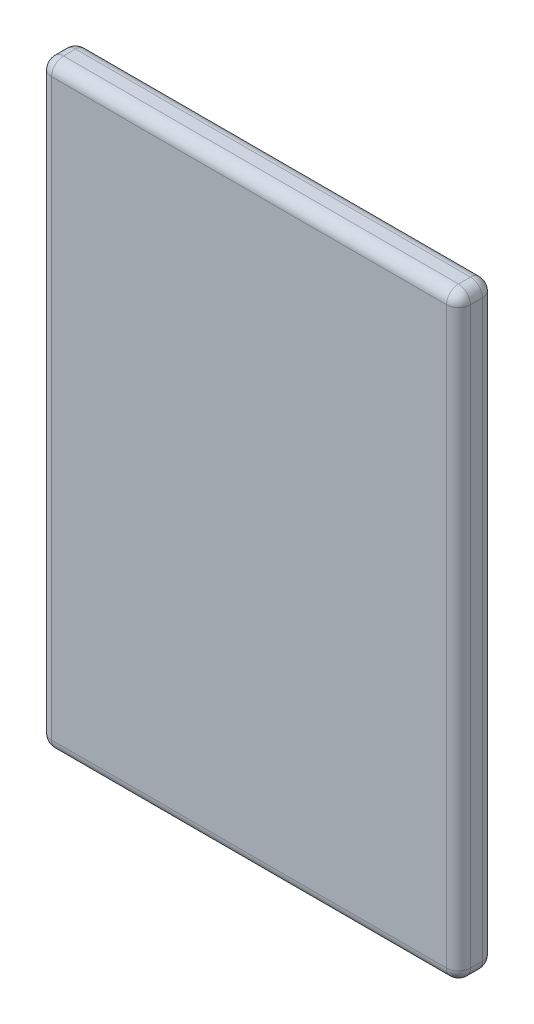
ISO-10303-21;
HEADER;
FILE_DESCRIPTION(('STEP AP214'),'2;1');
FILE_NAME('part.step','',(''),(''),'','','');
FILE_SCHEMA(('AUTOMOTIVE_DESIGN { 1 0 10303 214 1 1 1 1 }'));
ENDSEC;
DATA;
#1=APPLICATION_CONTEXT('core data for automotive mechanical design processes');
#2=APPLICATION_PROTOCOL_DEFINITION('international standard','automotive_design',2000,#1);
#3=PRODUCT_CONTEXT('',#1,'mechanical');
#4=PRODUCT('Part','Part','',(#3));
#5=PRODUCT_RELATED_PRODUCT_CATEGORY('part','',(#4));
#6=PRODUCT_DEFINITION_FORMATION('','',#4);
#7=PRODUCT_DEFINITION_CONTEXT('part definition',#1,'design');
#8=PRODUCT_DEFINITION('design','',#6,#7);
#9=PRODUCT_DEFINITION_SHAPE('','',#8);
#10=(LENGTH_UNIT() NAMED_UNIT(*) SI_UNIT(.MILLI.,.METRE.));
#11=(NAMED_UNIT(*) PLANE_ANGLE_UNIT() SI_UNIT($,.RADIAN.));
#12=(NAMED_UNIT(*) SI_UNIT($,.STERADIAN.) SOLID_ANGLE_UNIT());
#13=UNCERTAINTY_MEASURE_WITH_UNIT(LENGTH_MEASURE(1.E-05),#10,'distance_accuracy_value','');
#14=(GEOMETRIC_REPRESENTATION_CONTEXT(3) GLOBAL_UNCERTAINTY_ASSIGNED_CONTEXT((#13)) GLOBAL_UNIT_ASSIGNED_CONTEXT((#10,
#11,#12)) REPRESENTATION_CONTEXT('',''));
#15=CARTESIAN_POINT('',(0.,0.,0.));
#16=DIRECTION('',(0.,0.,1.));
#17=DIRECTION('',(1.,0.,0.));
#18=AXIS2_PLACEMENT_3D('',#15,#16,#17);
#19=CARTESIAN_POINT('',(0.,0.,6.));
#20=DIRECTION('',(1.,0.,0.));
#21=DIRECTION('',(0.,0.,-1.));
#22=AXIS2_PLACEMENT_3D('',#19,#20,#21);
#23=PLANE('',#22);
#24=DIRECTION('',(0.,0.,-1.));
#25=VECTOR('',#24,1.);
#26=CARTESIAN_POINT('',(0.,98.,6.));
#27=LINE('',#26,#25);
#28=CARTESIAN_POINT('',(0.,98.,4.));
#29=VERTEX_POINT('',#28);
#30=CARTESIAN_POINT('',(0.,98.,2.));
#31=VERTEX_POINT('',#30);
#32=EDGE_CURVE('E166',#29,#31,#27,.T.);
#33=ORIENTED_EDGE('',*,*,#32,.T.);
#34=DIRECTION('',(0.,-1.,0.));
#35=VECTOR('',#34,1.);
#36=CARTESIAN_POINT('',(0.,0.,2.));
#37=LINE('',#36,#35);
#38=CARTESIAN_POINT('',(0.,2.,2.));
#39=VERTEX_POINT('',#38);
#40=EDGE_CURVE('E171',#31,#39,#37,.T.);
#41=ORIENTED_EDGE('',*,*,#40,.T.);
#42=DIRECTION('',(0.,0.,-1.));
#43=VECTOR('',#42,1.);
#44=CARTESIAN_POINT('',(0.,2.,6.));
#45=LINE('',#44,#43);
#46=CARTESIAN_POINT('',(0.,2.,4.));
#47=VERTEX_POINT('',#46);
#48=EDGE_CURVE('E168',#39,#47,#45,.F.);
#49=ORIENTED_EDGE('',*,*,#48,.T.);
#50=DIRECTION('',(0.,-1.,0.));
#51=VECTOR('',#50,1.);
#52=CARTESIAN_POINT('',(0.,0.,4.));
#53=LINE('',#52,#51);
#54=EDGE_CURVE('E164',#47,#29,#53,.F.);
#55=ORIENTED_EDGE('',*,*,#54,.T.);
#56=EDGE_LOOP('',(#33,#41,#49,#55));
#57=FACE_BOUND('',#56,.T.);
#58=ADVANCED_FACE('F33',(#57),#23,.F.);
#59=CARTESIAN_POINT('',(0.,0.,6.));
#60=DIRECTION('',(0.,1.,0.));
#61=DIRECTION('',(-1.,0.,0.));
#62=AXIS2_PLACEMENT_3D('',#59,#60,#61);
#63=PLANE('',#62);
#64=DIRECTION('',(0.,0.,-1.));
#65=VECTOR('',#64,1.);
#66=CARTESIAN_POINT('',(2.,0.,6.));
#67=LINE('',#66,#65);
#68=CARTESIAN_POINT('',(2.,0.,4.));
#69=VERTEX_POINT('',#68);
#70=CARTESIAN_POINT('',(2.,0.,2.));
#71=VERTEX_POINT('',#70);
#72=EDGE_CURVE('E132',#69,#71,#67,.T.);
#73=ORIENTED_EDGE('',*,*,#72,.T.);
#74=DIRECTION('',(1.,0.,0.));
#75=VECTOR('',#74,1.);
#76=CARTESIAN_POINT('',(70.,0.,2.));
#77=LINE('',#76,#75);
#78=CARTESIAN_POINT('',(68.,0.,2.));
#79=VERTEX_POINT('',#78);
#80=EDGE_CURVE('E128',#71,#79,#77,.T.);
#81=ORIENTED_EDGE('',*,*,#80,.T.);
#82=DIRECTION('',(0.,0.,-1.));
#83=VECTOR('',#82,1.);
#84=CARTESIAN_POINT('',(68.,0.,6.));
#85=LINE('',#84,#83);
#86=CARTESIAN_POINT('',(68.,0.,4.));
#87=VERTEX_POINT('',#86);
#88=EDGE_CURVE('E120',#79,#87,#85,.F.);
#89=ORIENTED_EDGE('',*,*,#88,.T.);
#90=DIRECTION('',(1.,0.,0.));
#91=VECTOR('',#90,1.);
#92=CARTESIAN_POINT('',(0.,0.,4.));
#93=LINE('',#92,#91);
#94=EDGE_CURVE('E125',#87,#69,#93,.F.);
#95=ORIENTED_EDGE('',*,*,#94,.T.);
#96=EDGE_LOOP('',(#73,#81,#89,#95));
#97=FACE_BOUND('',#96,.T.);
#98=ADVANCED_FACE('F123',(#97),#63,.F.);
#99=CARTESIAN_POINT('',(70.,0.,6.));
#100=DIRECTION('',(-1.,0.,0.));
#101=DIRECTION('',(0.,-1.,0.));
#102=AXIS2_PLACEMENT_3D('',#99,#100,#101);
#103=PLANE('',#102);
#104=DIRECTION('',(0.,0.,-1.));
#105=VECTOR('',#104,1.);
#106=CARTESIAN_POINT('',(70.,2.00000000000001,6.));
#107=LINE('',#106,#105);
#108=CARTESIAN_POINT('',(70.,2.00000000000001,4.));
#109=VERTEX_POINT('',#108);
#110=CARTESIAN_POINT('',(70.,2.00000000000001,2.));
#111=VERTEX_POINT('',#110);
#112=EDGE_CURVE('E140',#109,#111,#107,.T.);
#113=ORIENTED_EDGE('',*,*,#112,.T.);
#114=DIRECTION('',(0.,1.,0.));
#115=VECTOR('',#114,1.);
#116=CARTESIAN_POINT('',(70.,100.,2.));
#117=LINE('',#116,#115);
#118=CARTESIAN_POINT('',(70.,98.,2.));
#119=VERTEX_POINT('',#118);
#120=EDGE_CURVE('E187',#111,#119,#117,.T.);
#121=ORIENTED_EDGE('',*,*,#120,.T.);
#122=DIRECTION('',(0.,0.,-1.));
#123=VECTOR('',#122,1.);
#124=CARTESIAN_POINT('',(70.,98.,6.));
#125=LINE('',#124,#123);
#126=CARTESIAN_POINT('',(70.,98.,4.));
#127=VERTEX_POINT('',#126);
#128=EDGE_CURVE('E184',#119,#127,#125,.F.);
#129=ORIENTED_EDGE('',*,*,#128,.T.);
#130=DIRECTION('',(0.,1.,0.));
#131=VECTOR('',#130,1.);
#132=CARTESIAN_POINT('',(70.,0.,4.));
#133=LINE('',#132,#131);
#134=EDGE_CURVE('E182',#127,#109,#133,.F.);
#135=ORIENTED_EDGE('',*,*,#134,.T.);
#136=EDGE_LOOP('',(#113,#121,#129,#135));
#137=FACE_BOUND('',#136,.T.);
#138=ADVANCED_FACE('F296',(#137),#103,.F.);
#139=CARTESIAN_POINT('',(0.,100.,6.));
#140=DIRECTION('',(0.,-1.,0.));
#141=DIRECTION('',(1.,0.,0.));
#142=AXIS2_PLACEMENT_3D('',#139,#140,#141);
#143=PLANE('',#142);
#144=DIRECTION('',(0.,0.,-1.));
#145=VECTOR('',#144,1.);
#146=CARTESIAN_POINT('',(68.,100.,6.));
#147=LINE('',#146,#145);
#148=CARTESIAN_POINT('',(68.,100.,4.));
#149=VERTEX_POINT('',#148);
#150=CARTESIAN_POINT('',(68.,100.,2.));
#151=VERTEX_POINT('',#150);
#152=EDGE_CURVE('E175',#149,#151,#147,.T.);
#153=ORIENTED_EDGE('',*,*,#152,.T.);
#154=DIRECTION('',(-1.,0.,0.));
#155=VECTOR('',#154,1.);
#156=CARTESIAN_POINT('',(0.,100.,2.));
#157=LINE('',#156,#155);
#158=CARTESIAN_POINT('',(2.,100.,2.));
#159=VERTEX_POINT('',#158);
#160=EDGE_CURVE('E180',#151,#159,#157,.T.);
#161=ORIENTED_EDGE('',*,*,#160,.T.);
#162=DIRECTION('',(0.,0.,-1.));
#163=VECTOR('',#162,1.);
#164=CARTESIAN_POINT('',(2.,100.,6.));
#165=LINE('',#164,#163);
#166=CARTESIAN_POINT('',(2.,100.,4.));
#167=VERTEX_POINT('',#166);
#168=EDGE_CURVE('E177',#159,#167,#165,.F.);
#169=ORIENTED_EDGE('',*,*,#168,.T.);
#170=DIRECTION('',(-1.,0.,0.));
#171=VECTOR('',#170,1.);
#172=CARTESIAN_POINT('',(0.,100.,4.));
#173=LINE('',#172,#171);
#174=EDGE_CURVE('E173',#167,#149,#173,.F.);
#175=ORIENTED_EDGE('',*,*,#174,.T.);
#176=EDGE_LOOP('',(#153,#161,#169,#175));
#177=FACE_BOUND('',#176,.T.);
#178=ADVANCED_FACE('F273',(#177),#143,.F.);
#179=CARTESIAN_POINT('',(0.,0.,6.));
#180=DIRECTION('',(0.,0.,-1.));
#181=DIRECTION('',(-1.,0.,0.));
#182=AXIS2_PLACEMENT_3D('',#179,#180,#181);
#183=PLANE('',#182);
#184=DIRECTION('',(0.,1.,0.));
#185=VECTOR('',#184,1.);
#186=CARTESIAN_POINT('',(68.,0.,6.));
#187=LINE('',#186,#185);
#188=CARTESIAN_POINT('',(68.,2.00000000000001,6.));
#189=VERTEX_POINT('',#188);
#190=CARTESIAN_POINT('',(68.,98.,6.));
#191=VERTEX_POINT('',#190);
#192=EDGE_CURVE('E42',#189,#191,#187,.T.);
#193=ORIENTED_EDGE('',*,*,#192,.T.);
#194=DIRECTION('',(-1.,0.,0.));
#195=VECTOR('',#194,1.);
#196=CARTESIAN_POINT('',(0.,98.,6.));
#197=LINE('',#196,#195);
#198=CARTESIAN_POINT('',(2.,98.,6.));
#199=VERTEX_POINT('',#198);
#200=EDGE_CURVE('E11',#191,#199,#197,.T.);
#201=ORIENTED_EDGE('',*,*,#200,.T.);
#202=DIRECTION('',(0.,-1.,0.));
#203=VECTOR('',#202,1.);
#204=CARTESIAN_POINT('',(2.,0.,6.));
#205=LINE('',#204,#203);
#206=CARTESIAN_POINT('',(2.,2.,6.));
#207=VERTEX_POINT('',#206);
#208=EDGE_CURVE('E198',#199,#207,#205,.T.);
#209=ORIENTED_EDGE('',*,*,#208,.T.);
#210=DIRECTION('',(1.,0.,0.));
#211=VECTOR('',#210,1.);
#212=CARTESIAN_POINT('',(0.,2.,6.));
#213=LINE('',#212,#211);
#214=EDGE_CURVE('E53',#207,#189,#213,.T.);
#215=ORIENTED_EDGE('',*,*,#214,.T.);
#216=EDGE_LOOP('',(#193,#201,#209,#215));
#217=FACE_BOUND('',#216,.T.);
#218=ADVANCED_FACE('F303',(#217),#183,.F.);
#219=CARTESIAN_POINT('',(0.,0.,0.));
#220=DIRECTION('',(0.,0.,-1.));
#221=DIRECTION('',(-1.,0.,0.));
#222=AXIS2_PLACEMENT_3D('',#219,#220,#221);
#223=PLANE('',#222);
#224=DIRECTION('',(0.,1.,0.));
#225=VECTOR('',#224,1.);
#226=CARTESIAN_POINT('',(68.,0.,0.));
#227=LINE('',#226,#225);
#228=CARTESIAN_POINT('',(68.,98.,0.));
#229=VERTEX_POINT('',#228);
#230=CARTESIAN_POINT('',(68.,2.00000000000001,0.));
#231=VERTEX_POINT('',#230);
#232=EDGE_CURVE('E193',#229,#231,#227,.F.);
#233=ORIENTED_EDGE('',*,*,#232,.T.);
#234=DIRECTION('',(1.,0.,0.));
#235=VECTOR('',#234,1.);
#236=CARTESIAN_POINT('',(0.,2.,0.));
#237=LINE('',#236,#235);
#238=CARTESIAN_POINT('',(2.,2.,0.));
#239=VERTEX_POINT('',#238);
#240=EDGE_CURVE('E195',#231,#239,#237,.F.);
#241=ORIENTED_EDGE('',*,*,#240,.T.);
#242=DIRECTION('',(0.,-1.,0.));
#243=VECTOR('',#242,1.);
#244=CARTESIAN_POINT('',(2.,100.,0.));
#245=LINE('',#244,#243);
#246=CARTESIAN_POINT('',(2.,98.,0.));
#247=VERTEX_POINT('',#246);
#248=EDGE_CURVE('E189',#239,#247,#245,.F.);
#249=ORIENTED_EDGE('',*,*,#248,.T.);
#250=DIRECTION('',(-1.,0.,0.));
#251=VECTOR('',#250,1.);
#252=CARTESIAN_POINT('',(70.,98.,0.));
#253=LINE('',#252,#251);
#254=EDGE_CURVE('E191',#247,#229,#253,.F.);
#255=ORIENTED_EDGE('',*,*,#254,.T.);
#256=EDGE_LOOP('',(#233,#241,#249,#255));
#257=FACE_BOUND('',#256,.T.);
#258=ADVANCED_FACE('F264',(#257),#223,.T.);
#259=CARTESIAN_POINT('',(68.,98.,6.));
#260=DIRECTION('',(0.,0.,-1.));
#261=DIRECTION('',(-1.,0.,0.));
#262=AXIS2_PLACEMENT_3D('',#259,#260,#261);
#263=CYLINDRICAL_SURFACE('',#262,2.);
#264=CARTESIAN_POINT('',(68.,98.,4.));
#265=DIRECTION('',(0.,0.,1.));
#266=DIRECTION('',(1.,0.,0.));
#267=AXIS2_PLACEMENT_3D('',#264,#265,#266);
#268=CIRCLE('',#267,2.);
#269=EDGE_CURVE('E37',#127,#149,#268,.T.);
#270=ORIENTED_EDGE('',*,*,#269,.F.);
#271=ORIENTED_EDGE('',*,*,#128,.F.);
#272=CARTESIAN_POINT('',(68.,98.,2.));
#273=DIRECTION('',(0.,0.,-1.));
#274=DIRECTION('',(-1.,0.,0.));
#275=AXIS2_PLACEMENT_3D('',#272,#273,#274);
#276=CIRCLE('',#275,2.);
#277=EDGE_CURVE('E160',#151,#119,#276,.T.);
#278=ORIENTED_EDGE('',*,*,#277,.F.);
#279=ORIENTED_EDGE('',*,*,#152,.F.);
#280=EDGE_LOOP('',(#270,#271,#278,#279));
#281=FACE_BOUND('',#280,.T.);
#282=ADVANCED_FACE('F35',(#281),#263,.T.);
#283=CARTESIAN_POINT('',(68.,98.,4.));
#284=DIRECTION('',(0.,0.,1.));
#285=DIRECTION('',(1.,0.,0.));
#286=AXIS2_PLACEMENT_3D('',#283,#284,#285);
#287=SPHERICAL_SURFACE('',#286,2.);
#288=CARTESIAN_POINT('',(68.,98.,4.));
#289=DIRECTION('',(0.,1.,0.));
#290=DIRECTION('',(0.,0.,1.));
#291=AXIS2_PLACEMENT_3D('',#288,#289,#290);
#292=CIRCLE('',#291,2.);
#293=EDGE_CURVE('E243',#127,#191,#292,.F.);
#294=ORIENTED_EDGE('',*,*,#293,.F.);
#295=ORIENTED_EDGE('',*,*,#269,.T.);
#296=CARTESIAN_POINT('',(68.,98.,4.));
#297=DIRECTION('',(1.,0.,0.));
#298=DIRECTION('',(0.,0.,-1.));
#299=AXIS2_PLACEMENT_3D('',#296,#297,#298);
#300=CIRCLE('',#299,2.);
#301=EDGE_CURVE('E245',#191,#149,#300,.F.);
#302=ORIENTED_EDGE('',*,*,#301,.F.);
#303=EDGE_LOOP('',(#294,#295,#302));
#304=FACE_BOUND('',#303,.T.);
#305=ADVANCED_FACE('F291',(#304),#287,.T.);
#306=CARTESIAN_POINT('',(68.,98.,2.));
#307=DIRECTION('',(0.,0.,1.));
#308=DIRECTION('',(1.,0.,0.));
#309=AXIS2_PLACEMENT_3D('',#306,#307,#308);
#310=SPHERICAL_SURFACE('',#309,2.);
#311=CARTESIAN_POINT('',(68.,98.,2.));
#312=DIRECTION('',(1.,0.,0.));
#313=DIRECTION('',(0.,0.,-1.));
#314=AXIS2_PLACEMENT_3D('',#311,#312,#313);
#315=CIRCLE('',#314,2.);
#316=EDGE_CURVE('E237',#151,#229,#315,.F.);
#317=ORIENTED_EDGE('',*,*,#316,.F.);
#318=ORIENTED_EDGE('',*,*,#277,.T.);
#319=CARTESIAN_POINT('',(68.,98.,2.));
#320=DIRECTION('',(0.,1.,0.));
#321=DIRECTION('',(0.,0.,1.));
#322=AXIS2_PLACEMENT_3D('',#319,#320,#321);
#323=CIRCLE('',#322,2.);
#324=EDGE_CURVE('E240',#229,#119,#323,.F.);
#325=ORIENTED_EDGE('',*,*,#324,.F.);
#326=EDGE_LOOP('',(#317,#318,#325));
#327=FACE_BOUND('',#326,.T.);
#328=ADVANCED_FACE('F252',(#327),#310,.T.);
#329=CARTESIAN_POINT('',(0.,98.,4.));
#330=DIRECTION('',(-1.,0.,0.));
#331=DIRECTION('',(0.,-1.,0.));
#332=AXIS2_PLACEMENT_3D('',#329,#330,#331);
#333=CYLINDRICAL_SURFACE('',#332,2.);
#334=ORIENTED_EDGE('',*,*,#301,.T.);
#335=ORIENTED_EDGE('',*,*,#174,.F.);
#336=CARTESIAN_POINT('',(2.,98.,4.));
#337=DIRECTION('',(-1.,0.,0.));
#338=DIRECTION('',(0.,-1.,0.));
#339=AXIS2_PLACEMENT_3D('',#336,#337,#338);
#340=CIRCLE('',#339,2.);
#341=EDGE_CURVE('E232',#199,#167,#340,.T.);
#342=ORIENTED_EDGE('',*,*,#341,.F.);
#343=ORIENTED_EDGE('',*,*,#200,.F.);
#344=EDGE_LOOP('',(#334,#335,#342,#343));
#345=FACE_BOUND('',#344,.T.);
#346=ADVANCED_FACE('F285',(#345),#333,.T.);
#347=CARTESIAN_POINT('',(68.,0.,4.));
#348=DIRECTION('',(0.,1.,0.));
#349=DIRECTION('',(-1.,0.,0.));
#350=AXIS2_PLACEMENT_3D('',#347,#348,#349);
#351=CYLINDRICAL_SURFACE('',#350,2.);
#352=ORIENTED_EDGE('',*,*,#293,.T.);
#353=ORIENTED_EDGE('',*,*,#192,.F.);
#354=CARTESIAN_POINT('',(68.,2.00000000000001,4.));
#355=DIRECTION('',(0.,-1.,0.));
#356=DIRECTION('',(1.,0.,0.));
#357=AXIS2_PLACEMENT_3D('',#354,#355,#356);
#358=CIRCLE('',#357,2.);
#359=EDGE_CURVE('E144',#109,#189,#358,.T.);
#360=ORIENTED_EDGE('',*,*,#359,.F.);
#361=ORIENTED_EDGE('',*,*,#134,.F.);
#362=EDGE_LOOP('',(#352,#353,#360,#361));
#363=FACE_BOUND('',#362,.T.);
#364=ADVANCED_FACE('F294',(#363),#351,.T.);
#365=CARTESIAN_POINT('',(68.,2.00000000000001,6.));
#366=DIRECTION('',(0.,0.,-1.));
#367=DIRECTION('',(-1.,0.,0.));
#368=AXIS2_PLACEMENT_3D('',#365,#366,#367);
#369=CYLINDRICAL_SURFACE('',#368,2.);
#370=CARTESIAN_POINT('',(68.,2.00000000000001,2.));
#371=DIRECTION('',(0.,0.,-1.));
#372=DIRECTION('',(-1.,0.,0.));
#373=AXIS2_PLACEMENT_3D('',#370,#371,#372);
#374=CIRCLE('',#373,2.);
#375=EDGE_CURVE('E145',#111,#79,#374,.T.);
#376=ORIENTED_EDGE('',*,*,#375,.F.);
#377=ORIENTED_EDGE('',*,*,#112,.F.);
#378=CARTESIAN_POINT('',(68.,2.00000000000001,4.));
#379=DIRECTION('',(0.,0.,1.));
#380=DIRECTION('',(1.,0.,0.));
#381=AXIS2_PLACEMENT_3D('',#378,#379,#380);
#382=CIRCLE('',#381,2.);
#383=EDGE_CURVE('E136',#87,#109,#382,.T.);
#384=ORIENTED_EDGE('',*,*,#383,.F.);
#385=ORIENTED_EDGE('',*,*,#88,.F.);
#386=EDGE_LOOP('',(#376,#377,#384,#385));
#387=FACE_BOUND('',#386,.T.);
#388=ADVANCED_FACE('F138',(#387),#369,.T.);
#389=CARTESIAN_POINT('',(68.,0.,2.));
#390=DIRECTION('',(0.,-1.,0.));
#391=DIRECTION('',(1.,0.,0.));
#392=AXIS2_PLACEMENT_3D('',#389,#390,#391);
#393=CYLINDRICAL_SURFACE('',#392,2.);
#394=ORIENTED_EDGE('',*,*,#324,.T.);
#395=ORIENTED_EDGE('',*,*,#120,.F.);
#396=CARTESIAN_POINT('',(68.,2.00000000000001,2.));
#397=DIRECTION('',(0.,-1.,0.));
#398=DIRECTION('',(1.,0.,0.));
#399=AXIS2_PLACEMENT_3D('',#396,#397,#398);
#400=CIRCLE('',#399,2.);
#401=EDGE_CURVE('E228',#231,#111,#400,.T.);
#402=ORIENTED_EDGE('',*,*,#401,.F.);
#403=ORIENTED_EDGE('',*,*,#232,.F.);
#404=EDGE_LOOP('',(#394,#395,#402,#403));
#405=FACE_BOUND('',#404,.T.);
#406=ADVANCED_FACE('F260',(#405),#393,.T.);
#407=CARTESIAN_POINT('',(0.,98.,2.));
#408=DIRECTION('',(1.,0.,0.));
#409=DIRECTION('',(0.,1.,0.));
#410=AXIS2_PLACEMENT_3D('',#407,#408,#409);
#411=CYLINDRICAL_SURFACE('',#410,2.);
#412=ORIENTED_EDGE('',*,*,#316,.T.);
#413=ORIENTED_EDGE('',*,*,#254,.F.);
#414=CARTESIAN_POINT('',(2.,98.,2.));
#415=DIRECTION('',(-1.,0.,0.));
#416=DIRECTION('',(0.,-1.,0.));
#417=AXIS2_PLACEMENT_3D('',#414,#415,#416);
#418=CIRCLE('',#417,2.);
#419=EDGE_CURVE('E225',#159,#247,#418,.T.);
#420=ORIENTED_EDGE('',*,*,#419,.F.);
#421=ORIENTED_EDGE('',*,*,#160,.F.);
#422=EDGE_LOOP('',(#412,#413,#420,#421));
#423=FACE_BOUND('',#422,.T.);
#424=ADVANCED_FACE('F270',(#423),#411,.T.);
#425=CARTESIAN_POINT('',(2.,98.,6.));
#426=DIRECTION('',(0.,0.,-1.));
#427=DIRECTION('',(-1.,0.,0.));
#428=AXIS2_PLACEMENT_3D('',#425,#426,#427);
#429=CYLINDRICAL_SURFACE('',#428,2.);
#430=CARTESIAN_POINT('',(2.,98.,4.));
#431=DIRECTION('',(0.,0.,1.));
#432=DIRECTION('',(1.,0.,0.));
#433=AXIS2_PLACEMENT_3D('',#430,#431,#432);
#434=CIRCLE('',#433,2.);
#435=EDGE_CURVE('E234',#167,#29,#434,.T.);
#436=ORIENTED_EDGE('',*,*,#435,.F.);
#437=ORIENTED_EDGE('',*,*,#168,.F.);
#438=CARTESIAN_POINT('',(2.,98.,2.));
#439=DIRECTION('',(0.,0.,-1.));
#440=DIRECTION('',(-1.,0.,0.));
#441=AXIS2_PLACEMENT_3D('',#438,#439,#440);
#442=CIRCLE('',#441,2.);
#443=EDGE_CURVE('E222',#31,#159,#442,.T.);
#444=ORIENTED_EDGE('',*,*,#443,.F.);
#445=ORIENTED_EDGE('',*,*,#32,.F.);
#446=EDGE_LOOP('',(#436,#437,#444,#445));
#447=FACE_BOUND('',#446,.T.);
#448=ADVANCED_FACE('F277',(#447),#429,.T.);
#449=CARTESIAN_POINT('',(2.,98.,4.));
#450=DIRECTION('',(0.,0.,1.));
#451=DIRECTION('',(1.,0.,0.));
#452=AXIS2_PLACEMENT_3D('',#449,#450,#451);
#453=SPHERICAL_SURFACE('',#452,2.);
#454=ORIENTED_EDGE('',*,*,#341,.T.);
#455=ORIENTED_EDGE('',*,*,#435,.T.);
#456=CARTESIAN_POINT('',(2.,98.,4.));
#457=DIRECTION('',(0.,1.,0.));
#458=DIRECTION('',(0.,0.,1.));
#459=AXIS2_PLACEMENT_3D('',#456,#457,#458);
#460=CIRCLE('',#459,2.);
#461=EDGE_CURVE('E151',#199,#29,#460,.F.);
#462=ORIENTED_EDGE('',*,*,#461,.F.);
#463=EDGE_LOOP('',(#454,#455,#462));
#464=FACE_BOUND('',#463,.T.);
#465=ADVANCED_FACE('F348',(#464),#453,.T.);
#466=CARTESIAN_POINT('',(68.,2.00000000000001,4.));
#467=DIRECTION('',(0.,0.,1.));
#468=DIRECTION('',(1.,0.,0.));
#469=AXIS2_PLACEMENT_3D('',#466,#467,#468);
#470=SPHERICAL_SURFACE('',#469,2.);
#471=ORIENTED_EDGE('',*,*,#383,.T.);
#472=ORIENTED_EDGE('',*,*,#359,.T.);
#473=CARTESIAN_POINT('',(68.,2.00000000000001,4.));
#474=DIRECTION('',(1.,0.,0.));
#475=DIRECTION('',(0.,0.,-1.));
#476=AXIS2_PLACEMENT_3D('',#473,#474,#475);
#477=CIRCLE('',#476,2.);
#478=EDGE_CURVE('E148',#87,#189,#477,.F.);
#479=ORIENTED_EDGE('',*,*,#478,.F.);
#480=EDGE_LOOP('',(#471,#472,#479));
#481=FACE_BOUND('',#480,.T.);
#482=ADVANCED_FACE('F149',(#481),#470,.T.);
#483=CARTESIAN_POINT('',(68.,2.00000000000001,2.));
#484=DIRECTION('',(0.,0.,1.));
#485=DIRECTION('',(1.,0.,0.));
#486=AXIS2_PLACEMENT_3D('',#483,#484,#485);
#487=SPHERICAL_SURFACE('',#486,2.);
#488=ORIENTED_EDGE('',*,*,#401,.T.);
#489=ORIENTED_EDGE('',*,*,#375,.T.);
#490=CARTESIAN_POINT('',(68.,2.00000000000001,2.));
#491=DIRECTION('',(1.,0.,0.));
#492=DIRECTION('',(0.,0.,-1.));
#493=AXIS2_PLACEMENT_3D('',#490,#491,#492);
#494=CIRCLE('',#493,2.);
#495=EDGE_CURVE('E152',#231,#79,#494,.F.);
#496=ORIENTED_EDGE('',*,*,#495,.F.);
#497=EDGE_LOOP('',(#488,#489,#496));
#498=FACE_BOUND('',#497,.T.);
#499=ADVANCED_FACE('F341',(#498),#487,.T.);
#500=CARTESIAN_POINT('',(2.,98.,2.));
#501=DIRECTION('',(0.,0.,1.));
#502=DIRECTION('',(1.,0.,0.));
#503=AXIS2_PLACEMENT_3D('',#500,#501,#502);
#504=SPHERICAL_SURFACE('',#503,2.);
#505=ORIENTED_EDGE('',*,*,#443,.T.);
#506=ORIENTED_EDGE('',*,*,#419,.T.);
#507=CARTESIAN_POINT('',(2.,98.,2.));
#508=DIRECTION('',(0.,1.,0.));
#509=DIRECTION('',(0.,0.,1.));
#510=AXIS2_PLACEMENT_3D('',#507,#508,#509);
#511=CIRCLE('',#510,2.);
#512=EDGE_CURVE('E215',#31,#247,#511,.F.);
#513=ORIENTED_EDGE('',*,*,#512,.F.);
#514=EDGE_LOOP('',(#505,#506,#513));
#515=FACE_BOUND('',#514,.T.);
#516=ADVANCED_FACE('F337',(#515),#504,.T.);
#517=CARTESIAN_POINT('',(2.,0.,4.));
#518=DIRECTION('',(0.,-1.,0.));
#519=DIRECTION('',(0.,0.,-1.));
#520=AXIS2_PLACEMENT_3D('',#517,#518,#519);
#521=CYLINDRICAL_SURFACE('',#520,2.);
#522=ORIENTED_EDGE('',*,*,#461,.T.);
#523=ORIENTED_EDGE('',*,*,#54,.F.);
#524=CARTESIAN_POINT('',(2.,2.,4.));
#525=DIRECTION('',(0.,-1.,0.));
#526=DIRECTION('',(0.,0.,-1.));
#527=AXIS2_PLACEMENT_3D('',#524,#525,#526);
#528=CIRCLE('',#527,2.);
#529=EDGE_CURVE('E212',#207,#47,#528,.T.);
#530=ORIENTED_EDGE('',*,*,#529,.F.);
#531=ORIENTED_EDGE('',*,*,#208,.F.);
#532=EDGE_LOOP('',(#522,#523,#530,#531));
#533=FACE_BOUND('',#532,.T.);
#534=ADVANCED_FACE('F334',(#533),#521,.T.);
#535=CARTESIAN_POINT('',(0.,2.,4.));
#536=DIRECTION('',(1.,0.,0.));
#537=DIRECTION('',(0.,1.,0.));
#538=AXIS2_PLACEMENT_3D('',#535,#536,#537);
#539=CYLINDRICAL_SURFACE('',#538,2.);
#540=ORIENTED_EDGE('',*,*,#478,.T.);
#541=ORIENTED_EDGE('',*,*,#214,.F.);
#542=CARTESIAN_POINT('',(2.,2.,4.));
#543=DIRECTION('',(-1.,0.,0.));
#544=DIRECTION('',(0.,-1.,0.));
#545=AXIS2_PLACEMENT_3D('',#542,#543,#544);
#546=CIRCLE('',#545,2.);
#547=EDGE_CURVE('E156',#69,#207,#546,.T.);
#548=ORIENTED_EDGE('',*,*,#547,.F.);
#549=ORIENTED_EDGE('',*,*,#94,.F.);
#550=EDGE_LOOP('',(#540,#541,#548,#549));
#551=FACE_BOUND('',#550,.T.);
#552=ADVANCED_FACE('F154',(#551),#539,.T.);
#553=CARTESIAN_POINT('',(0.,2.,2.));
#554=DIRECTION('',(-1.,0.,0.));
#555=DIRECTION('',(0.,-1.,0.));
#556=AXIS2_PLACEMENT_3D('',#553,#554,#555);
#557=CYLINDRICAL_SURFACE('',#556,2.);
#558=ORIENTED_EDGE('',*,*,#495,.T.);
#559=ORIENTED_EDGE('',*,*,#80,.F.);
#560=CARTESIAN_POINT('',(2.,2.,2.));
#561=DIRECTION('',(-1.,0.,0.));
#562=DIRECTION('',(0.,-1.,0.));
#563=AXIS2_PLACEMENT_3D('',#560,#561,#562);
#564=CIRCLE('',#563,2.);
#565=EDGE_CURVE('E208',#239,#71,#564,.T.);
#566=ORIENTED_EDGE('',*,*,#565,.F.);
#567=ORIENTED_EDGE('',*,*,#240,.F.);
#568=EDGE_LOOP('',(#558,#559,#566,#567));
#569=FACE_BOUND('',#568,.T.);
#570=ADVANCED_FACE('F327',(#569),#557,.T.);
#571=CARTESIAN_POINT('',(2.,0.,2.));
#572=DIRECTION('',(0.,1.,0.));
#573=DIRECTION('',(0.,0.,1.));
#574=AXIS2_PLACEMENT_3D('',#571,#572,#573);
#575=CYLINDRICAL_SURFACE('',#574,2.);
#576=ORIENTED_EDGE('',*,*,#512,.T.);
#577=ORIENTED_EDGE('',*,*,#248,.F.);
#578=CARTESIAN_POINT('',(2.,2.,2.));
#579=DIRECTION('',(0.,-1.,0.));
#580=DIRECTION('',(0.,0.,-1.));
#581=AXIS2_PLACEMENT_3D('',#578,#579,#580);
#582=CIRCLE('',#581,2.);
#583=EDGE_CURVE('E206',#39,#239,#582,.T.);
#584=ORIENTED_EDGE('',*,*,#583,.F.);
#585=ORIENTED_EDGE('',*,*,#40,.F.);
#586=EDGE_LOOP('',(#576,#577,#584,#585));
#587=FACE_BOUND('',#586,.T.);
#588=ADVANCED_FACE('F323',(#587),#575,.T.);
#589=CARTESIAN_POINT('',(2.,2.,4.));
#590=DIRECTION('',(0.,0.,1.));
#591=DIRECTION('',(1.,0.,0.));
#592=AXIS2_PLACEMENT_3D('',#589,#590,#591);
#593=SPHERICAL_SURFACE('',#592,2.);
#594=ORIENTED_EDGE('',*,*,#547,.T.);
#595=ORIENTED_EDGE('',*,*,#529,.T.);
#596=CARTESIAN_POINT('',(2.,2.,4.));
#597=DIRECTION('',(0.,0.,1.));
#598=DIRECTION('',(1.,0.,0.));
#599=AXIS2_PLACEMENT_3D('',#596,#597,#598);
#600=CIRCLE('',#599,2.);
#601=EDGE_CURVE('E204',#69,#47,#600,.F.);
#602=ORIENTED_EDGE('',*,*,#601,.F.);
#603=EDGE_LOOP('',(#594,#595,#602));
#604=FACE_BOUND('',#603,.T.);
#605=ADVANCED_FACE('F319',(#604),#593,.T.);
#606=CARTESIAN_POINT('',(2.,2.,2.));
#607=DIRECTION('',(0.,0.,1.));
#608=DIRECTION('',(1.,0.,0.));
#609=AXIS2_PLACEMENT_3D('',#606,#607,#608);
#610=SPHERICAL_SURFACE('',#609,2.);
#611=ORIENTED_EDGE('',*,*,#583,.T.);
#612=ORIENTED_EDGE('',*,*,#565,.T.);
#613=CARTESIAN_POINT('',(2.,2.,2.));
#614=DIRECTION('',(0.,0.,-1.));
#615=DIRECTION('',(-1.,0.,0.));
#616=AXIS2_PLACEMENT_3D('',#613,#614,#615);
#617=CIRCLE('',#616,2.);
#618=EDGE_CURVE('E202',#39,#71,#617,.F.);
#619=ORIENTED_EDGE('',*,*,#618,.F.);
#620=EDGE_LOOP('',(#611,#612,#619));
#621=FACE_BOUND('',#620,.T.);
#622=ADVANCED_FACE('F315',(#621),#610,.T.);
#623=CARTESIAN_POINT('',(2.,2.,6.));
#624=DIRECTION('',(0.,0.,-1.));
#625=DIRECTION('',(-1.,0.,0.));
#626=AXIS2_PLACEMENT_3D('',#623,#624,#625);
#627=CYLINDRICAL_SURFACE('',#626,2.);
#628=ORIENTED_EDGE('',*,*,#601,.T.);
#629=ORIENTED_EDGE('',*,*,#48,.F.);
#630=ORIENTED_EDGE('',*,*,#618,.T.);
#631=ORIENTED_EDGE('',*,*,#72,.F.);
#632=EDGE_LOOP('',(#628,#629,#630,#631));
#633=FACE_BOUND('',#632,.T.);
#634=ADVANCED_FACE('F312',(#633),#627,.T.);
#635=CLOSED_SHELL('',(#58,#98,#138,#178,#218,#258,#282,#305,#328,#346,#364,#388,#406,#424,#448,
#465,#482,#499,#516,#534,#552,#570,#588,#605,#622,#634));
#636=MANIFOLD_SOLID_BREP('B2',#635);
#637=ADVANCED_BREP_SHAPE_REPRESENTATION('',(#18,#636),#14);
#638=SHAPE_DEFINITION_REPRESENTATION(#9,#637);
ENDSEC;
END-ISO-10303-21;
